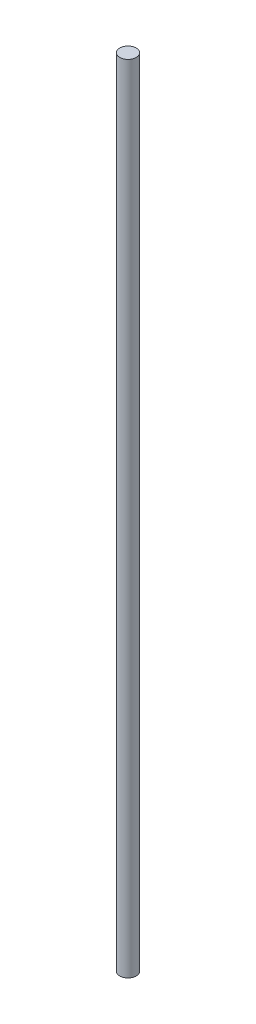
ISO-10303-21;
HEADER;
FILE_DESCRIPTION(('STEP AP214'),'2;1');
FILE_NAME('part.step','',(''),(''),'','','');
FILE_SCHEMA(('AUTOMOTIVE_DESIGN { 1 0 10303 214 1 1 1 1 }'));
ENDSEC;
DATA;
#1=APPLICATION_CONTEXT('core data for automotive mechanical design processes');
#2=APPLICATION_PROTOCOL_DEFINITION('international standard','automotive_design',2000,#1);
#3=PRODUCT_CONTEXT('',#1,'mechanical');
#4=PRODUCT('Part','Part','',(#3));
#5=PRODUCT_RELATED_PRODUCT_CATEGORY('part','',(#4));
#6=PRODUCT_DEFINITION_FORMATION('','',#4);
#7=PRODUCT_DEFINITION_CONTEXT('part definition',#1,'design');
#8=PRODUCT_DEFINITION('design','',#6,#7);
#9=PRODUCT_DEFINITION_SHAPE('','',#8);
#10=(LENGTH_UNIT() NAMED_UNIT(*) SI_UNIT(.MILLI.,.METRE.));
#11=(NAMED_UNIT(*) PLANE_ANGLE_UNIT() SI_UNIT($,.RADIAN.));
#12=(NAMED_UNIT(*) SI_UNIT($,.STERADIAN.) SOLID_ANGLE_UNIT());
#13=UNCERTAINTY_MEASURE_WITH_UNIT(LENGTH_MEASURE(1.E-05),#10,'distance_accuracy_value','');
#14=(GEOMETRIC_REPRESENTATION_CONTEXT(3) GLOBAL_UNCERTAINTY_ASSIGNED_CONTEXT((#13)) GLOBAL_UNIT_ASSIGNED_CONTEXT((#10,
#11,#12)) REPRESENTATION_CONTEXT('',''));
#15=CARTESIAN_POINT('',(0.,0.,0.));
#16=DIRECTION('',(0.,0.,1.));
#17=DIRECTION('',(1.,0.,0.));
#18=AXIS2_PLACEMENT_3D('',#15,#16,#17);
#19=CARTESIAN_POINT('',(0.,400.,0.));
#20=DIRECTION('',(0.,-1.,0.));
#21=DIRECTION('',(0.,0.,-1.));
#22=AXIS2_PLACEMENT_3D('',#19,#20,#21);
#23=CYLINDRICAL_SURFACE('',#22,4.125);
#24=CARTESIAN_POINT('',(0.,400.,0.));
#25=DIRECTION('',(0.,1.,0.));
#26=DIRECTION('',(0.,0.,1.));
#27=AXIS2_PLACEMENT_3D('',#24,#25,#26);
#28=CIRCLE('',#27,4.125);
#29=CARTESIAN_POINT('',(0.,400.,4.125));
#30=VERTEX_POINT('',#29);
#31=EDGE_CURVE('E10',#30,#30,#28,.T.);
#32=ORIENTED_EDGE('',*,*,#31,.F.);
#33=EDGE_LOOP('',(#32));
#34=FACE_BOUND('',#33,.T.);
#35=CARTESIAN_POINT('',(0.,0.,0.));
#36=DIRECTION('',(0.,1.,0.));
#37=DIRECTION('',(0.,0.,1.));
#38=AXIS2_PLACEMENT_3D('',#35,#36,#37);
#39=CIRCLE('',#38,4.125);
#40=CARTESIAN_POINT('',(0.,0.,4.125));
#41=VERTEX_POINT('',#40);
#42=EDGE_CURVE('E33',#41,#41,#39,.T.);
#43=ORIENTED_EDGE('',*,*,#42,.T.);
#44=EDGE_LOOP('',(#43));
#45=FACE_BOUND('',#44,.T.);
#46=ADVANCED_FACE('F30',(#34,#45),#23,.T.);
#47=CARTESIAN_POINT('',(0.,400.,0.));
#48=DIRECTION('',(0.,1.,0.));
#49=DIRECTION('',(0.,0.,1.));
#50=AXIS2_PLACEMENT_3D('',#47,#48,#49);
#51=PLANE('',#50);
#52=ORIENTED_EDGE('',*,*,#31,.T.);
#53=EDGE_LOOP('',(#52));
#54=FACE_BOUND('',#53,.T.);
#55=ADVANCED_FACE('F45',(#54),#51,.T.);
#56=CARTESIAN_POINT('',(0.,0.,0.));
#57=DIRECTION('',(0.,1.,0.));
#58=DIRECTION('',(0.,0.,1.));
#59=AXIS2_PLACEMENT_3D('',#56,#57,#58);
#60=PLANE('',#59);
#61=ORIENTED_EDGE('',*,*,#42,.F.);
#62=EDGE_LOOP('',(#61));
#63=FACE_BOUND('',#62,.T.);
#64=ADVANCED_FACE('F43',(#63),#60,.F.);
#65=CLOSED_SHELL('',(#46,#55,#64));
#66=MANIFOLD_SOLID_BREP('B2',#65);
#67=ADVANCED_BREP_SHAPE_REPRESENTATION('',(#18,#66),#14);
#68=SHAPE_DEFINITION_REPRESENTATION(#9,#67);
ENDSEC;
END-ISO-10303-21;
